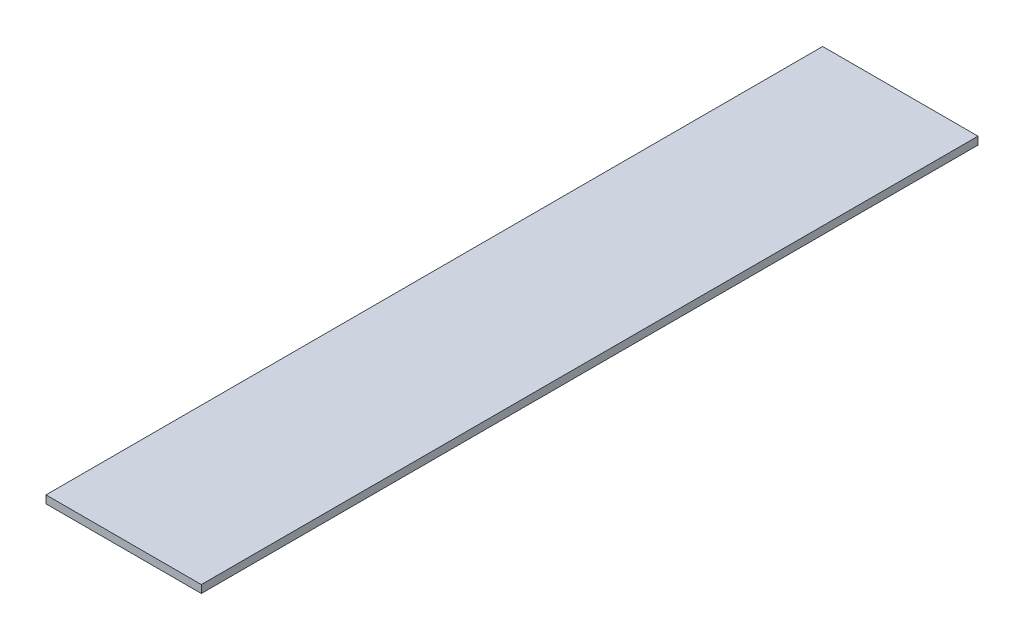
ISO-10303-21;
HEADER;
FILE_DESCRIPTION(('STEP AP214'),'2;1');
FILE_NAME('part.step','',(''),(''),'','','');
FILE_SCHEMA(('AUTOMOTIVE_DESIGN { 1 0 10303 214 1 1 1 1 }'));
ENDSEC;
DATA;
#1=APPLICATION_CONTEXT('core data for automotive mechanical design processes');
#2=APPLICATION_PROTOCOL_DEFINITION('international standard','automotive_design',2000,#1);
#3=PRODUCT_CONTEXT('',#1,'mechanical');
#4=PRODUCT('Part','Part','',(#3));
#5=PRODUCT_RELATED_PRODUCT_CATEGORY('part','',(#4));
#6=PRODUCT_DEFINITION_FORMATION('','',#4);
#7=PRODUCT_DEFINITION_CONTEXT('part definition',#1,'design');
#8=PRODUCT_DEFINITION('design','',#6,#7);
#9=PRODUCT_DEFINITION_SHAPE('','',#8);
#10=(LENGTH_UNIT() NAMED_UNIT(*) SI_UNIT(.MILLI.,.METRE.));
#11=(NAMED_UNIT(*) PLANE_ANGLE_UNIT() SI_UNIT($,.RADIAN.));
#12=(NAMED_UNIT(*) SI_UNIT($,.STERADIAN.) SOLID_ANGLE_UNIT());
#13=UNCERTAINTY_MEASURE_WITH_UNIT(LENGTH_MEASURE(1.E-05),#10,'distance_accuracy_value','');
#14=(GEOMETRIC_REPRESENTATION_CONTEXT(3) GLOBAL_UNCERTAINTY_ASSIGNED_CONTEXT((#13)) GLOBAL_UNIT_ASSIGNED_CONTEXT((#10,
#11,#12)) REPRESENTATION_CONTEXT('',''));
#15=CARTESIAN_POINT('',(0.,0.,0.));
#16=DIRECTION('',(0.,0.,1.));
#17=DIRECTION('',(1.,0.,0.));
#18=AXIS2_PLACEMENT_3D('',#15,#16,#17);
#19=CARTESIAN_POINT('',(0.,0.,1000.));
#20=DIRECTION('',(1.,0.,0.));
#21=DIRECTION('',(0.,1.,0.));
#22=AXIS2_PLACEMENT_3D('',#19,#20,#21);
#23=PLANE('',#22);
#24=DIRECTION('',(0.,-1.,0.));
#25=VECTOR('',#24,1.);
#26=CARTESIAN_POINT('',(0.,0.,0.));
#27=LINE('',#26,#25);
#28=CARTESIAN_POINT('',(0.,0.,0.));
#29=VERTEX_POINT('',#28);
#30=CARTESIAN_POINT('',(0.,-10.,0.));
#31=VERTEX_POINT('',#30);
#32=EDGE_CURVE('E97',#29,#31,#27,.T.);
#33=ORIENTED_EDGE('',*,*,#32,.T.);
#34=DIRECTION('',(0.,0.,-1.));
#35=VECTOR('',#34,1.);
#36=CARTESIAN_POINT('',(0.,-10.,1000.));
#37=LINE('',#36,#35);
#38=CARTESIAN_POINT('',(0.,-10.,1000.));
#39=VERTEX_POINT('',#38);
#40=EDGE_CURVE('E11',#39,#31,#37,.T.);
#41=ORIENTED_EDGE('',*,*,#40,.F.);
#42=DIRECTION('',(0.,-1.,0.));
#43=VECTOR('',#42,1.);
#44=CARTESIAN_POINT('',(0.,0.,1000.));
#45=LINE('',#44,#43);
#46=CARTESIAN_POINT('',(0.,0.,1000.));
#47=VERTEX_POINT('',#46);
#48=EDGE_CURVE('E83',#47,#39,#45,.T.);
#49=ORIENTED_EDGE('',*,*,#48,.F.);
#50=DIRECTION('',(0.,0.,-1.));
#51=VECTOR('',#50,1.);
#52=CARTESIAN_POINT('',(0.,0.,1000.));
#53=LINE('',#52,#51);
#54=EDGE_CURVE('E50',#47,#29,#53,.T.);
#55=ORIENTED_EDGE('',*,*,#54,.T.);
#56=EDGE_LOOP('',(#33,#41,#49,#55));
#57=FACE_BOUND('',#56,.T.);
#58=ADVANCED_FACE('F34',(#57),#23,.F.);
#59=CARTESIAN_POINT('',(0.,-10.,1000.));
#60=DIRECTION('',(0.,1.,0.));
#61=DIRECTION('',(0.,0.,1.));
#62=AXIS2_PLACEMENT_3D('',#59,#60,#61);
#63=PLANE('',#62);
#64=DIRECTION('',(1.,0.,0.));
#65=VECTOR('',#64,1.);
#66=CARTESIAN_POINT('',(0.,-10.,0.));
#67=LINE('',#66,#65);
#68=CARTESIAN_POINT('',(200.,-10.,0.));
#69=VERTEX_POINT('',#68);
#70=EDGE_CURVE('E88',#31,#69,#67,.T.);
#71=ORIENTED_EDGE('',*,*,#70,.T.);
#72=DIRECTION('',(0.,0.,-1.));
#73=VECTOR('',#72,1.);
#74=CARTESIAN_POINT('',(200.,-10.,1000.));
#75=LINE('',#74,#73);
#76=CARTESIAN_POINT('',(200.,-10.,1000.));
#77=VERTEX_POINT('',#76);
#78=EDGE_CURVE('E42',#77,#69,#75,.T.);
#79=ORIENTED_EDGE('',*,*,#78,.F.);
#80=DIRECTION('',(1.,0.,0.));
#81=VECTOR('',#80,1.);
#82=CARTESIAN_POINT('',(0.,-10.,1000.));
#83=LINE('',#82,#81);
#84=EDGE_CURVE('E75',#39,#77,#83,.T.);
#85=ORIENTED_EDGE('',*,*,#84,.F.);
#86=ORIENTED_EDGE('',*,*,#40,.T.);
#87=EDGE_LOOP('',(#71,#79,#85,#86));
#88=FACE_BOUND('',#87,.T.);
#89=ADVANCED_FACE('F87',(#88),#63,.F.);
#90=CARTESIAN_POINT('',(200.,0.,1000.));
#91=DIRECTION('',(1.,0.,0.));
#92=DIRECTION('',(0.,0.,-1.));
#93=AXIS2_PLACEMENT_3D('',#90,#91,#92);
#94=PLANE('',#93);
#95=DIRECTION('',(0.,-1.,0.));
#96=VECTOR('',#95,1.);
#97=CARTESIAN_POINT('',(200.,0.,0.));
#98=LINE('',#97,#96);
#99=CARTESIAN_POINT('',(200.,0.,0.));
#100=VERTEX_POINT('',#99);
#101=EDGE_CURVE('E100',#100,#69,#98,.T.);
#102=ORIENTED_EDGE('',*,*,#101,.F.);
#103=DIRECTION('',(0.,0.,-1.));
#104=VECTOR('',#103,1.);
#105=CARTESIAN_POINT('',(200.,0.,1000.));
#106=LINE('',#105,#104);
#107=CARTESIAN_POINT('',(200.,0.,1000.));
#108=VERTEX_POINT('',#107);
#109=EDGE_CURVE('E64',#108,#100,#106,.T.);
#110=ORIENTED_EDGE('',*,*,#109,.F.);
#111=DIRECTION('',(0.,-1.,0.));
#112=VECTOR('',#111,1.);
#113=CARTESIAN_POINT('',(200.,0.,1000.));
#114=LINE('',#113,#112);
#115=EDGE_CURVE('E82',#108,#77,#114,.T.);
#116=ORIENTED_EDGE('',*,*,#115,.T.);
#117=ORIENTED_EDGE('',*,*,#78,.T.);
#118=EDGE_LOOP('',(#102,#110,#116,#117));
#119=FACE_BOUND('',#118,.T.);
#120=ADVANCED_FACE('F91',(#119),#94,.T.);
#121=CARTESIAN_POINT('',(0.,0.,1000.));
#122=DIRECTION('',(0.,1.,0.));
#123=DIRECTION('',(0.,0.,1.));
#124=AXIS2_PLACEMENT_3D('',#121,#122,#123);
#125=PLANE('',#124);
#126=DIRECTION('',(1.,0.,0.));
#127=VECTOR('',#126,1.);
#128=CARTESIAN_POINT('',(0.,0.,0.));
#129=LINE('',#128,#127);
#130=EDGE_CURVE('E102',#29,#100,#129,.T.);
#131=ORIENTED_EDGE('',*,*,#130,.F.);
#132=ORIENTED_EDGE('',*,*,#54,.F.);
#133=DIRECTION('',(1.,0.,0.));
#134=VECTOR('',#133,1.);
#135=CARTESIAN_POINT('',(0.,0.,1000.));
#136=LINE('',#135,#134);
#137=EDGE_CURVE('E92',#47,#108,#136,.T.);
#138=ORIENTED_EDGE('',*,*,#137,.T.);
#139=ORIENTED_EDGE('',*,*,#109,.T.);
#140=EDGE_LOOP('',(#131,#132,#138,#139));
#141=FACE_BOUND('',#140,.T.);
#142=ADVANCED_FACE('F108',(#141),#125,.T.);
#143=CARTESIAN_POINT('',(0.,0.,1000.));
#144=DIRECTION('',(0.,0.,1.));
#145=DIRECTION('',(1.,0.,0.));
#146=AXIS2_PLACEMENT_3D('',#143,#144,#145);
#147=PLANE('',#146);
#148=ORIENTED_EDGE('',*,*,#48,.T.);
#149=ORIENTED_EDGE('',*,*,#84,.T.);
#150=ORIENTED_EDGE('',*,*,#115,.F.);
#151=ORIENTED_EDGE('',*,*,#137,.F.);
#152=EDGE_LOOP('',(#148,#149,#150,#151));
#153=FACE_BOUND('',#152,.T.);
#154=ADVANCED_FACE('F79',(#153),#147,.T.);
#155=CARTESIAN_POINT('',(0.,0.,0.));
#156=DIRECTION('',(0.,0.,1.));
#157=DIRECTION('',(1.,0.,0.));
#158=AXIS2_PLACEMENT_3D('',#155,#156,#157);
#159=PLANE('',#158);
#160=ORIENTED_EDGE('',*,*,#32,.F.);
#161=ORIENTED_EDGE('',*,*,#130,.T.);
#162=ORIENTED_EDGE('',*,*,#101,.T.);
#163=ORIENTED_EDGE('',*,*,#70,.F.);
#164=EDGE_LOOP('',(#160,#161,#162,#163));
#165=FACE_BOUND('',#164,.T.);
#166=ADVANCED_FACE('F107',(#165),#159,.F.);
#167=CLOSED_SHELL('',(#58,#89,#120,#142,#154,#166));
#168=MANIFOLD_SOLID_BREP('B2',#167);
#169=ADVANCED_BREP_SHAPE_REPRESENTATION('',(#18,#168),#14);
#170=SHAPE_DEFINITION_REPRESENTATION(#9,#169);
ENDSEC;
END-ISO-10303-21;
